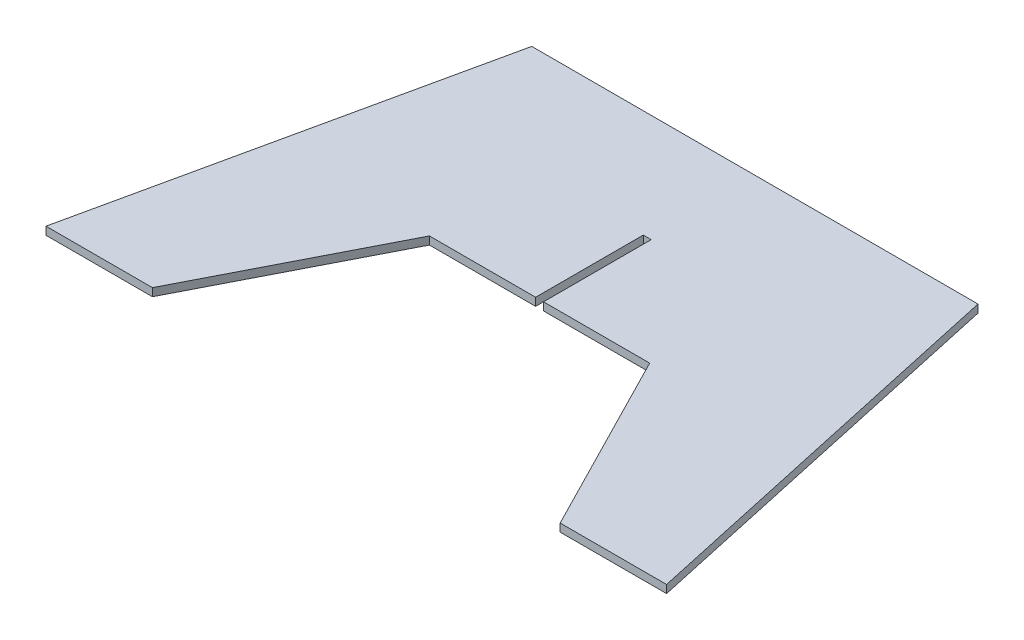
ISO-10303-21;
HEADER;
FILE_DESCRIPTION(('STEP AP214'),'2;1');
FILE_NAME('part.step','',(''),(''),'','','');
FILE_SCHEMA(('AUTOMOTIVE_DESIGN { 1 0 10303 214 1 1 1 1 }'));
ENDSEC;
DATA;
#1=APPLICATION_CONTEXT('core data for automotive mechanical design processes');
#2=APPLICATION_PROTOCOL_DEFINITION('international standard','automotive_design',2000,#1);
#3=PRODUCT_CONTEXT('',#1,'mechanical');
#4=PRODUCT('Part','Part','',(#3));
#5=PRODUCT_RELATED_PRODUCT_CATEGORY('part','',(#4));
#6=PRODUCT_DEFINITION_FORMATION('','',#4);
#7=PRODUCT_DEFINITION_CONTEXT('part definition',#1,'design');
#8=PRODUCT_DEFINITION('design','',#6,#7);
#9=PRODUCT_DEFINITION_SHAPE('','',#8);
#10=(LENGTH_UNIT() NAMED_UNIT(*) SI_UNIT(.MILLI.,.METRE.));
#11=(NAMED_UNIT(*) PLANE_ANGLE_UNIT() SI_UNIT($,.RADIAN.));
#12=(NAMED_UNIT(*) SI_UNIT($,.STERADIAN.) SOLID_ANGLE_UNIT());
#13=UNCERTAINTY_MEASURE_WITH_UNIT(LENGTH_MEASURE(1.E-05),#10,'distance_accuracy_value','');
#14=(GEOMETRIC_REPRESENTATION_CONTEXT(3) GLOBAL_UNCERTAINTY_ASSIGNED_CONTEXT((#13)) GLOBAL_UNIT_ASSIGNED_CONTEXT((#10,
#11,#12)) REPRESENTATION_CONTEXT('',''));
#15=CARTESIAN_POINT('',(0.,0.,0.));
#16=DIRECTION('',(0.,0.,1.));
#17=DIRECTION('',(1.,0.,0.));
#18=AXIS2_PLACEMENT_3D('',#15,#16,#17);
#19=CARTESIAN_POINT('',(0.,0.8636,-20.));
#20=DIRECTION('',(0.,0.,1.));
#21=DIRECTION('',(1.,0.,0.));
#22=AXIS2_PLACEMENT_3D('',#19,#20,#21);
#23=PLANE('',#22);
#24=DIRECTION('',(-1.,0.,0.));
#25=VECTOR('',#24,1.);
#26=CARTESIAN_POINT('',(0.,0.,-20.));
#27=LINE('',#26,#25);
#28=CARTESIAN_POINT('',(-0.431800000000001,0.,-20.));
#29=VERTEX_POINT('',#28);
#30=CARTESIAN_POINT('',(-12.0201149425287,0.,-20.));
#31=VERTEX_POINT('',#30);
#32=EDGE_CURVE('E166',#29,#31,#27,.T.);
#33=ORIENTED_EDGE('',*,*,#32,.F.);
#34=DIRECTION('',(0.,-1.,0.));
#35=VECTOR('',#34,1.);
#36=CARTESIAN_POINT('',(-0.431800000000001,0.8636,-20.));
#37=LINE('',#36,#35);
#38=CARTESIAN_POINT('',(-0.431800000000001,0.8636,-20.));
#39=VERTEX_POINT('',#38);
#40=EDGE_CURVE('E11',#39,#29,#37,.T.);
#41=ORIENTED_EDGE('',*,*,#40,.F.);
#42=DIRECTION('',(-1.,0.,0.));
#43=VECTOR('',#42,1.);
#44=CARTESIAN_POINT('',(0.,0.8636,-20.));
#45=LINE('',#44,#43);
#46=CARTESIAN_POINT('',(-12.0201149425287,0.8636,-20.));
#47=VERTEX_POINT('',#46);
#48=EDGE_CURVE('E207',#39,#47,#45,.T.);
#49=ORIENTED_EDGE('',*,*,#48,.T.);
#50=DIRECTION('',(0.,-1.,0.));
#51=VECTOR('',#50,1.);
#52=CARTESIAN_POINT('',(-12.0201149425287,0.8636,-20.));
#53=LINE('',#52,#51);
#54=EDGE_CURVE('E60',#47,#31,#53,.T.);
#55=ORIENTED_EDGE('',*,*,#54,.T.);
#56=EDGE_LOOP('',(#33,#41,#49,#55));
#57=FACE_BOUND('',#56,.T.);
#58=ADVANCED_FACE('F42',(#57),#23,.T.);
#59=CARTESIAN_POINT('',(-0.431800000000001,0.8636,0.));
#60=DIRECTION('',(-1.,0.,0.));
#61=DIRECTION('',(0.,0.,1.));
#62=AXIS2_PLACEMENT_3D('',#59,#60,#61);
#63=PLANE('',#62);
#64=DIRECTION('',(0.,0.,-1.));
#65=VECTOR('',#64,1.);
#66=CARTESIAN_POINT('',(-0.431800000000001,0.,0.));
#67=LINE('',#66,#65);
#68=CARTESIAN_POINT('',(-0.431800000000001,0.,-31.75));
#69=VERTEX_POINT('',#68);
#70=EDGE_CURVE('E169',#29,#69,#67,.T.);
#71=ORIENTED_EDGE('',*,*,#70,.T.);
#72=DIRECTION('',(0.,-1.,0.));
#73=VECTOR('',#72,1.);
#74=CARTESIAN_POINT('',(-0.431800000000001,0.8636,-31.75));
#75=LINE('',#74,#73);
#76=CARTESIAN_POINT('',(-0.431800000000001,0.8636,-31.75));
#77=VERTEX_POINT('',#76);
#78=EDGE_CURVE('E52',#77,#69,#75,.T.);
#79=ORIENTED_EDGE('',*,*,#78,.F.);
#80=DIRECTION('',(0.,0.,-1.));
#81=VECTOR('',#80,1.);
#82=CARTESIAN_POINT('',(-0.431800000000001,0.8636,0.));
#83=LINE('',#82,#81);
#84=EDGE_CURVE('E253',#39,#77,#83,.T.);
#85=ORIENTED_EDGE('',*,*,#84,.F.);
#86=ORIENTED_EDGE('',*,*,#40,.T.);
#87=EDGE_LOOP('',(#71,#79,#85,#86));
#88=FACE_BOUND('',#87,.T.);
#89=ADVANCED_FACE('F44',(#88),#63,.F.);
#90=CARTESIAN_POINT('',(0.,0.8636,-31.75));
#91=DIRECTION('',(0.,0.,1.));
#92=DIRECTION('',(1.,0.,0.));
#93=AXIS2_PLACEMENT_3D('',#90,#91,#92);
#94=PLANE('',#93);
#95=DIRECTION('',(-1.,0.,0.));
#96=VECTOR('',#95,1.);
#97=CARTESIAN_POINT('',(0.,0.,-31.75));
#98=LINE('',#97,#96);
#99=CARTESIAN_POINT('',(0.431799999999999,0.,-31.75));
#100=VERTEX_POINT('',#99);
#101=EDGE_CURVE('E174',#100,#69,#98,.T.);
#102=ORIENTED_EDGE('',*,*,#101,.F.);
#103=DIRECTION('',(0.,-1.,0.));
#104=VECTOR('',#103,1.);
#105=CARTESIAN_POINT('',(0.431799999999999,0.8636,-31.75));
#106=LINE('',#105,#104);
#107=CARTESIAN_POINT('',(0.431799999999999,0.8636,-31.75));
#108=VERTEX_POINT('',#107);
#109=EDGE_CURVE('E229',#108,#100,#106,.T.);
#110=ORIENTED_EDGE('',*,*,#109,.F.);
#111=DIRECTION('',(-1.,0.,0.));
#112=VECTOR('',#111,1.);
#113=CARTESIAN_POINT('',(0.,0.8636,-31.75));
#114=LINE('',#113,#112);
#115=EDGE_CURVE('E238',#108,#77,#114,.T.);
#116=ORIENTED_EDGE('',*,*,#115,.T.);
#117=ORIENTED_EDGE('',*,*,#78,.T.);
#118=EDGE_LOOP('',(#102,#110,#116,#117));
#119=FACE_BOUND('',#118,.T.);
#120=ADVANCED_FACE('F236',(#119),#94,.T.);
#121=CARTESIAN_POINT('',(0.431800000000005,0.8636,0.));
#122=DIRECTION('',(-1.,0.,0.));
#123=DIRECTION('',(0.,0.,1.));
#124=AXIS2_PLACEMENT_3D('',#121,#122,#123);
#125=PLANE('',#124);
#126=DIRECTION('',(0.,0.,-1.));
#127=VECTOR('',#126,1.);
#128=CARTESIAN_POINT('',(0.431800000000005,0.,0.));
#129=LINE('',#128,#127);
#130=CARTESIAN_POINT('',(0.431800000000001,0.,-20.));
#131=VERTEX_POINT('',#130);
#132=EDGE_CURVE('E178',#131,#100,#129,.T.);
#133=ORIENTED_EDGE('',*,*,#132,.F.);
#134=DIRECTION('',(0.,-1.,0.));
#135=VECTOR('',#134,1.);
#136=CARTESIAN_POINT('',(0.431800000000001,0.8636,-20.));
#137=LINE('',#136,#135);
#138=CARTESIAN_POINT('',(0.431800000000001,0.8636,-20.));
#139=VERTEX_POINT('',#138);
#140=EDGE_CURVE('E226',#139,#131,#137,.T.);
#141=ORIENTED_EDGE('',*,*,#140,.F.);
#142=DIRECTION('',(0.,0.,-1.));
#143=VECTOR('',#142,1.);
#144=CARTESIAN_POINT('',(0.431800000000005,0.8636,0.));
#145=LINE('',#144,#143);
#146=EDGE_CURVE('E250',#139,#108,#145,.T.);
#147=ORIENTED_EDGE('',*,*,#146,.T.);
#148=ORIENTED_EDGE('',*,*,#109,.T.);
#149=EDGE_LOOP('',(#133,#141,#147,#148));
#150=FACE_BOUND('',#149,.T.);
#151=ADVANCED_FACE('F247',(#150),#125,.T.);
#152=CARTESIAN_POINT('',(12.0201149425287,0.,-20.));
#153=VERTEX_POINT('',#152);
#154=EDGE_CURVE('E170',#153,#131,#27,.T.);
#155=ORIENTED_EDGE('',*,*,#154,.F.);
#156=DIRECTION('',(0.,-1.,0.));
#157=VECTOR('',#156,1.);
#158=CARTESIAN_POINT('',(12.0201149425287,0.8636,-20.));
#159=LINE('',#158,#157);
#160=CARTESIAN_POINT('',(12.0201149425287,0.8636,-20.));
#161=VERTEX_POINT('',#160);
#162=EDGE_CURVE('E223',#161,#153,#159,.T.);
#163=ORIENTED_EDGE('',*,*,#162,.F.);
#164=EDGE_CURVE('E258',#161,#139,#45,.T.);
#165=ORIENTED_EDGE('',*,*,#164,.T.);
#166=ORIENTED_EDGE('',*,*,#140,.T.);
#167=EDGE_LOOP('',(#155,#163,#165,#166));
#168=FACE_BOUND('',#167,.T.);
#169=ADVANCED_FACE('F291',(#168),#23,.T.);
#170=CARTESIAN_POINT('',(17.6359661753541,0.8636,-9.02069534256617));
#171=DIRECTION('',(-0.890296407537591,0.,0.455381495809458));
#172=DIRECTION('',(0.455381495809458,0.,0.890296407537591));
#173=AXIS2_PLACEMENT_3D('',#170,#171,#172);
#174=PLANE('',#173);
#175=DIRECTION('',(-0.455381495809458,0.,-0.890296407537591));
#176=VECTOR('',#175,1.);
#177=CARTESIAN_POINT('',(17.6359661753541,0.,-9.02069534256617));
#178=LINE('',#177,#176);
#179=CARTESIAN_POINT('',(22.25,0.,0.));
#180=VERTEX_POINT('',#179);
#181=EDGE_CURVE('E182',#180,#153,#178,.T.);
#182=ORIENTED_EDGE('',*,*,#181,.F.);
#183=DIRECTION('',(0.,-1.,0.));
#184=VECTOR('',#183,1.);
#185=CARTESIAN_POINT('',(22.25,0.8636,0.));
#186=LINE('',#185,#184);
#187=CARTESIAN_POINT('',(22.25,0.8636,0.));
#188=VERTEX_POINT('',#187);
#189=EDGE_CURVE('E220',#188,#180,#186,.T.);
#190=ORIENTED_EDGE('',*,*,#189,.F.);
#191=DIRECTION('',(-0.455381495809458,0.,-0.890296407537591));
#192=VECTOR('',#191,1.);
#193=CARTESIAN_POINT('',(17.6359661753541,0.8636,-9.02069534256617));
#194=LINE('',#193,#192);
#195=EDGE_CURVE('E263',#188,#161,#194,.T.);
#196=ORIENTED_EDGE('',*,*,#195,.T.);
#197=ORIENTED_EDGE('',*,*,#162,.T.);
#198=EDGE_LOOP('',(#182,#190,#196,#197));
#199=FACE_BOUND('',#198,.T.);
#200=ADVANCED_FACE('F298',(#199),#174,.T.);
#201=CARTESIAN_POINT('',(0.,0.8636,0.));
#202=DIRECTION('',(0.,0.,1.));
#203=DIRECTION('',(1.,0.,0.));
#204=AXIS2_PLACEMENT_3D('',#201,#202,#203);
#205=PLANE('',#204);
#206=DIRECTION('',(-1.,0.,0.));
#207=VECTOR('',#206,1.);
#208=CARTESIAN_POINT('',(0.,0.,0.));
#209=LINE('',#208,#207);
#210=CARTESIAN_POINT('',(33.8636,0.,0.));
#211=VERTEX_POINT('',#210);
#212=EDGE_CURVE('E186',#211,#180,#209,.T.);
#213=ORIENTED_EDGE('',*,*,#212,.F.);
#214=DIRECTION('',(0.,-1.,0.));
#215=VECTOR('',#214,1.);
#216=CARTESIAN_POINT('',(33.8636,0.8636,0.));
#217=LINE('',#216,#215);
#218=CARTESIAN_POINT('',(33.8636,0.8636,0.));
#219=VERTEX_POINT('',#218);
#220=EDGE_CURVE('E217',#219,#211,#217,.T.);
#221=ORIENTED_EDGE('',*,*,#220,.F.);
#222=DIRECTION('',(-1.,0.,0.));
#223=VECTOR('',#222,1.);
#224=CARTESIAN_POINT('',(0.,0.8636,0.));
#225=LINE('',#224,#223);
#226=EDGE_CURVE('E267',#219,#188,#225,.T.);
#227=ORIENTED_EDGE('',*,*,#226,.T.);
#228=ORIENTED_EDGE('',*,*,#189,.T.);
#229=EDGE_LOOP('',(#213,#221,#227,#228));
#230=FACE_BOUND('',#229,.T.);
#231=ADVANCED_FACE('F304',(#230),#205,.T.);
#232=CARTESIAN_POINT('',(32.3178008588941,0.8636,-7.06801448853277));
#233=DIRECTION('',(0.976909510195615,0.,-0.213653478533264));
#234=DIRECTION('',(-0.213653478533265,0.,-0.976909510195615));
#235=AXIS2_PLACEMENT_3D('',#232,#233,#234);
#236=PLANE('',#235);
#237=DIRECTION('',(0.213653478533264,0.,0.976909510195615));
#238=VECTOR('',#237,1.);
#239=CARTESIAN_POINT('',(32.3178008588941,0.,-7.06801448853277));
#240=LINE('',#239,#238);
#241=CARTESIAN_POINT('',(24.35,0.,-43.5));
#242=VERTEX_POINT('',#241);
#243=EDGE_CURVE('E190',#242,#211,#240,.T.);
#244=ORIENTED_EDGE('',*,*,#243,.F.);
#245=DIRECTION('',(0.,-1.,0.));
#246=VECTOR('',#245,1.);
#247=CARTESIAN_POINT('',(24.35,0.8636,-43.5));
#248=LINE('',#247,#246);
#249=CARTESIAN_POINT('',(24.35,0.8636,-43.5));
#250=VERTEX_POINT('',#249);
#251=EDGE_CURVE('E214',#250,#242,#248,.T.);
#252=ORIENTED_EDGE('',*,*,#251,.F.);
#253=DIRECTION('',(0.213653478533264,0.,0.976909510195615));
#254=VECTOR('',#253,1.);
#255=CARTESIAN_POINT('',(32.3178008588941,0.8636,-7.06801448853277));
#256=LINE('',#255,#254);
#257=EDGE_CURVE('E271',#250,#219,#256,.T.);
#258=ORIENTED_EDGE('',*,*,#257,.T.);
#259=ORIENTED_EDGE('',*,*,#220,.T.);
#260=EDGE_LOOP('',(#244,#252,#258,#259));
#261=FACE_BOUND('',#260,.T.);
#262=ADVANCED_FACE('F313',(#261),#236,.T.);
#263=CARTESIAN_POINT('',(0.,0.8636,-43.5));
#264=DIRECTION('',(0.,0.,-1.));
#265=DIRECTION('',(-1.,0.,0.));
#266=AXIS2_PLACEMENT_3D('',#263,#264,#265);
#267=PLANE('',#266);
#268=DIRECTION('',(1.,0.,0.));
#269=VECTOR('',#268,1.);
#270=CARTESIAN_POINT('',(0.,0.,-43.5));
#271=LINE('',#270,#269);
#272=CARTESIAN_POINT('',(-24.35,0.,-43.5));
#273=VERTEX_POINT('',#272);
#274=EDGE_CURVE('E194',#273,#242,#271,.T.);
#275=ORIENTED_EDGE('',*,*,#274,.F.);
#276=DIRECTION('',(0.,-1.,0.));
#277=VECTOR('',#276,1.);
#278=CARTESIAN_POINT('',(-24.35,0.8636,-43.5));
#279=LINE('',#278,#277);
#280=CARTESIAN_POINT('',(-24.35,0.8636,-43.5));
#281=VERTEX_POINT('',#280);
#282=EDGE_CURVE('E144',#281,#273,#279,.T.);
#283=ORIENTED_EDGE('',*,*,#282,.F.);
#284=DIRECTION('',(1.,0.,0.));
#285=VECTOR('',#284,1.);
#286=CARTESIAN_POINT('',(0.,0.8636,-43.5));
#287=LINE('',#286,#285);
#288=EDGE_CURVE('E155',#281,#250,#287,.T.);
#289=ORIENTED_EDGE('',*,*,#288,.T.);
#290=ORIENTED_EDGE('',*,*,#251,.T.);
#291=EDGE_LOOP('',(#275,#283,#289,#290));
#292=FACE_BOUND('',#291,.T.);
#293=ADVANCED_FACE('F277',(#292),#267,.T.);
#294=CARTESIAN_POINT('',(-32.3178008588941,0.8636,-7.06801448853276));
#295=DIRECTION('',(-0.976909510195615,0.,-0.213653478533264));
#296=DIRECTION('',(-0.213653478533264,0.,0.976909510195615));
#297=AXIS2_PLACEMENT_3D('',#294,#295,#296);
#298=PLANE('',#297);
#299=DIRECTION('',(0.213653478533264,0.,-0.976909510195615));
#300=VECTOR('',#299,1.);
#301=CARTESIAN_POINT('',(-32.3178008588941,0.,-7.06801448853276));
#302=LINE('',#301,#300);
#303=CARTESIAN_POINT('',(-33.8636,0.,0.));
#304=VERTEX_POINT('',#303);
#305=EDGE_CURVE('E139',#304,#273,#302,.T.);
#306=ORIENTED_EDGE('',*,*,#305,.F.);
#307=DIRECTION('',(0.,-1.,0.));
#308=VECTOR('',#307,1.);
#309=CARTESIAN_POINT('',(-33.8636,0.8636,0.));
#310=LINE('',#309,#308);
#311=CARTESIAN_POINT('',(-33.8636,0.8636,0.));
#312=VERTEX_POINT('',#311);
#313=EDGE_CURVE('E134',#312,#304,#310,.T.);
#314=ORIENTED_EDGE('',*,*,#313,.F.);
#315=DIRECTION('',(0.213653478533264,0.,-0.976909510195615));
#316=VECTOR('',#315,1.);
#317=CARTESIAN_POINT('',(-32.3178008588941,0.8636,-7.06801448853276));
#318=LINE('',#317,#316);
#319=EDGE_CURVE('E137',#312,#281,#318,.T.);
#320=ORIENTED_EDGE('',*,*,#319,.T.);
#321=ORIENTED_EDGE('',*,*,#282,.T.);
#322=EDGE_LOOP('',(#306,#314,#320,#321));
#323=FACE_BOUND('',#322,.T.);
#324=ADVANCED_FACE('F136',(#323),#298,.T.);
#325=CARTESIAN_POINT('',(0.,0.8636,0.));
#326=DIRECTION('',(0.,0.,1.));
#327=DIRECTION('',(1.,0.,0.));
#328=AXIS2_PLACEMENT_3D('',#325,#326,#327);
#329=PLANE('',#328);
#330=DIRECTION('',(-1.,0.,0.));
#331=VECTOR('',#330,1.);
#332=CARTESIAN_POINT('',(0.,0.,0.));
#333=LINE('',#332,#331);
#334=CARTESIAN_POINT('',(-22.25,0.,0.));
#335=VERTEX_POINT('',#334);
#336=EDGE_CURVE('E200',#335,#304,#333,.T.);
#337=ORIENTED_EDGE('',*,*,#336,.F.);
#338=DIRECTION('',(0.,-1.,0.));
#339=VECTOR('',#338,1.);
#340=CARTESIAN_POINT('',(-22.25,0.8636,0.));
#341=LINE('',#340,#339);
#342=CARTESIAN_POINT('',(-22.25,0.8636,0.));
#343=VERTEX_POINT('',#342);
#344=EDGE_CURVE('E97',#343,#335,#341,.T.);
#345=ORIENTED_EDGE('',*,*,#344,.F.);
#346=DIRECTION('',(-1.,0.,0.));
#347=VECTOR('',#346,1.);
#348=CARTESIAN_POINT('',(0.,0.8636,0.));
#349=LINE('',#348,#347);
#350=EDGE_CURVE('E152',#343,#312,#349,.T.);
#351=ORIENTED_EDGE('',*,*,#350,.T.);
#352=ORIENTED_EDGE('',*,*,#313,.T.);
#353=EDGE_LOOP('',(#337,#345,#351,#352));
#354=FACE_BOUND('',#353,.T.);
#355=ADVANCED_FACE('F158',(#354),#329,.T.);
#356=CARTESIAN_POINT('',(-17.6359661753541,0.8636,-9.02069534256616));
#357=DIRECTION('',(0.890296407537591,0.,0.455381495809457));
#358=DIRECTION('',(0.455381495809457,0.,-0.890296407537591));
#359=AXIS2_PLACEMENT_3D('',#356,#357,#358);
#360=PLANE('',#359);
#361=DIRECTION('',(-0.455381495809457,0.,0.890296407537591));
#362=VECTOR('',#361,1.);
#363=CARTESIAN_POINT('',(-17.6359661753541,0.,-9.02069534256616));
#364=LINE('',#363,#362);
#365=EDGE_CURVE('E203',#31,#335,#364,.T.);
#366=ORIENTED_EDGE('',*,*,#365,.F.);
#367=ORIENTED_EDGE('',*,*,#54,.F.);
#368=DIRECTION('',(-0.455381495809457,0.,0.890296407537591));
#369=VECTOR('',#368,1.);
#370=CARTESIAN_POINT('',(-17.6359661753541,0.8636,-9.02069534256616));
#371=LINE('',#370,#369);
#372=EDGE_CURVE('E160',#47,#343,#371,.T.);
#373=ORIENTED_EDGE('',*,*,#372,.T.);
#374=ORIENTED_EDGE('',*,*,#344,.T.);
#375=EDGE_LOOP('',(#366,#367,#373,#374));
#376=FACE_BOUND('',#375,.T.);
#377=ADVANCED_FACE('F279',(#376),#360,.T.);
#378=CARTESIAN_POINT('',(0.,0.8636,0.));
#379=DIRECTION('',(0.,1.,0.));
#380=DIRECTION('',(0.,0.,1.));
#381=AXIS2_PLACEMENT_3D('',#378,#379,#380);
#382=PLANE('',#381);
#383=ORIENTED_EDGE('',*,*,#48,.F.);
#384=ORIENTED_EDGE('',*,*,#84,.T.);
#385=ORIENTED_EDGE('',*,*,#115,.F.);
#386=ORIENTED_EDGE('',*,*,#146,.F.);
#387=ORIENTED_EDGE('',*,*,#164,.F.);
#388=ORIENTED_EDGE('',*,*,#195,.F.);
#389=ORIENTED_EDGE('',*,*,#226,.F.);
#390=ORIENTED_EDGE('',*,*,#257,.F.);
#391=ORIENTED_EDGE('',*,*,#288,.F.);
#392=ORIENTED_EDGE('',*,*,#319,.F.);
#393=ORIENTED_EDGE('',*,*,#350,.F.);
#394=ORIENTED_EDGE('',*,*,#372,.F.);
#395=EDGE_LOOP('',(#383,#384,#385,#386,#387,#388,#389,#390,#391,#392,#393,#394));
#396=FACE_BOUND('',#395,.T.);
#397=ADVANCED_FACE('F150',(#396),#382,.T.);
#398=CARTESIAN_POINT('',(0.,0.,0.));
#399=DIRECTION('',(0.,1.,0.));
#400=DIRECTION('',(0.,0.,1.));
#401=AXIS2_PLACEMENT_3D('',#398,#399,#400);
#402=PLANE('',#401);
#403=ORIENTED_EDGE('',*,*,#32,.T.);
#404=ORIENTED_EDGE('',*,*,#365,.T.);
#405=ORIENTED_EDGE('',*,*,#336,.T.);
#406=ORIENTED_EDGE('',*,*,#305,.T.);
#407=ORIENTED_EDGE('',*,*,#274,.T.);
#408=ORIENTED_EDGE('',*,*,#243,.T.);
#409=ORIENTED_EDGE('',*,*,#212,.T.);
#410=ORIENTED_EDGE('',*,*,#181,.T.);
#411=ORIENTED_EDGE('',*,*,#154,.T.);
#412=ORIENTED_EDGE('',*,*,#132,.T.);
#413=ORIENTED_EDGE('',*,*,#101,.T.);
#414=ORIENTED_EDGE('',*,*,#70,.F.);
#415=EDGE_LOOP('',(#403,#404,#405,#406,#407,#408,#409,#410,#411,#412,#413,#414));
#416=FACE_BOUND('',#415,.T.);
#417=ADVANCED_FACE('F242',(#416),#402,.F.);
#418=CLOSED_SHELL('',(#58,#89,#120,#151,#169,#200,#231,#262,#293,#324,#355,#377,#397,#417));
#419=MANIFOLD_SOLID_BREP('B2',#418);
#420=ADVANCED_BREP_SHAPE_REPRESENTATION('',(#18,#419),#14);
#421=SHAPE_DEFINITION_REPRESENTATION(#9,#420);
ENDSEC;
END-ISO-10303-21;
